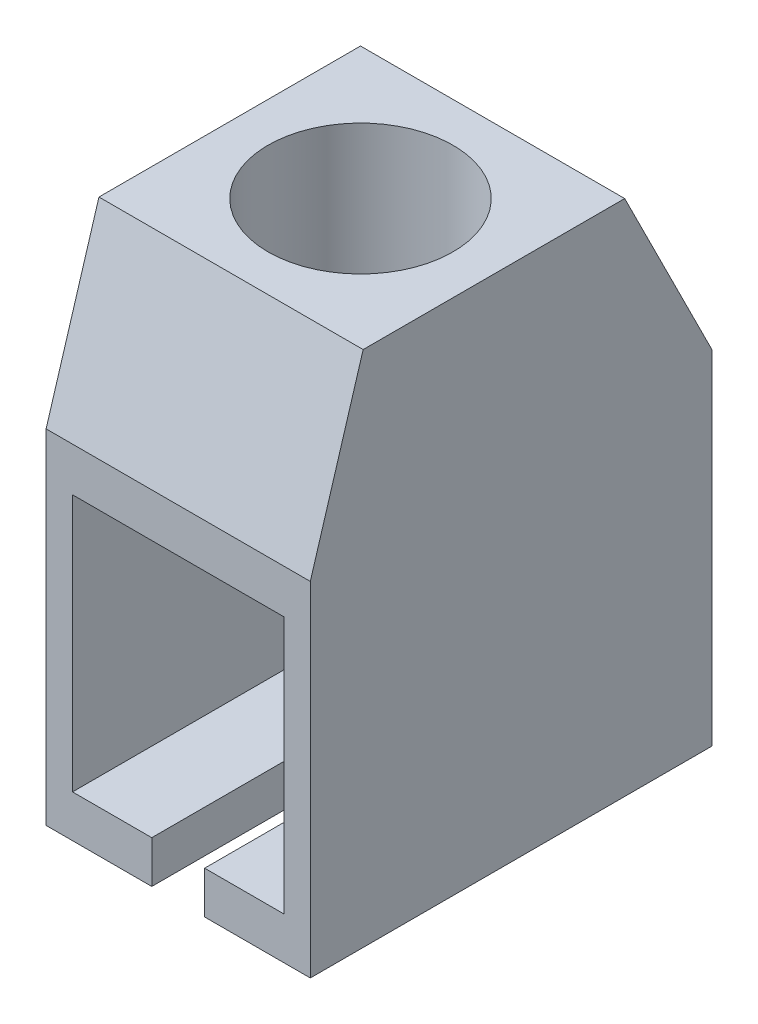
ISO-10303-21;
HEADER;
FILE_DESCRIPTION(('STEP AP214'),'2;1');
FILE_NAME('part.step','',(''),(''),'','','');
FILE_SCHEMA(('AUTOMOTIVE_DESIGN { 1 0 10303 214 1 1 1 1 }'));
ENDSEC;
DATA;
#1=APPLICATION_CONTEXT('core data for automotive mechanical design processes');
#2=APPLICATION_PROTOCOL_DEFINITION('international standard','automotive_design',2000,#1);
#3=PRODUCT_CONTEXT('',#1,'mechanical');
#4=PRODUCT('Part','Part','',(#3));
#5=PRODUCT_RELATED_PRODUCT_CATEGORY('part','',(#4));
#6=PRODUCT_DEFINITION_FORMATION('','',#4);
#7=PRODUCT_DEFINITION_CONTEXT('part definition',#1,'design');
#8=PRODUCT_DEFINITION('design','',#6,#7);
#9=PRODUCT_DEFINITION_SHAPE('','',#8);
#10=(LENGTH_UNIT() NAMED_UNIT(*) SI_UNIT(.MILLI.,.METRE.));
#11=(NAMED_UNIT(*) PLANE_ANGLE_UNIT() SI_UNIT($,.RADIAN.));
#12=(NAMED_UNIT(*) SI_UNIT($,.STERADIAN.) SOLID_ANGLE_UNIT());
#13=UNCERTAINTY_MEASURE_WITH_UNIT(LENGTH_MEASURE(1.E-05),#10,'distance_accuracy_value','');
#14=(GEOMETRIC_REPRESENTATION_CONTEXT(3) GLOBAL_UNCERTAINTY_ASSIGNED_CONTEXT((#13)) GLOBAL_UNIT_ASSIGNED_CONTEXT((#10,
#11,#12)) REPRESENTATION_CONTEXT('',''));
#15=CARTESIAN_POINT('',(0.,0.,0.));
#16=DIRECTION('',(0.,0.,1.));
#17=DIRECTION('',(1.,0.,0.));
#18=AXIS2_PLACEMENT_3D('',#15,#16,#17);
#19=CARTESIAN_POINT('',(-2.5,6.5,-3.8));
#20=DIRECTION('',(1.,0.,0.));
#21=DIRECTION('',(0.,0.,-1.));
#22=AXIS2_PLACEMENT_3D('',#19,#20,#21);
#23=PLANE('',#22);
#24=DIRECTION('',(0.,0.,1.));
#25=VECTOR('',#24,1.);
#26=CARTESIAN_POINT('',(-2.5,9.8,-3.8));
#27=LINE('',#26,#25);
#28=CARTESIAN_POINT('',(-2.5,9.8,-2.15));
#29=VERTEX_POINT('',#28);
#30=CARTESIAN_POINT('',(-2.5,9.8,2.8));
#31=VERTEX_POINT('',#30);
#32=EDGE_CURVE('E249',#29,#31,#27,.T.);
#33=ORIENTED_EDGE('',*,*,#32,.F.);
#34=DIRECTION('',(0.,-0.894427190999917,-0.447213595499956));
#35=VECTOR('',#34,1.);
#36=CARTESIAN_POINT('',(-2.5,9.8,-2.15));
#37=LINE('',#36,#35);
#38=CARTESIAN_POINT('',(-2.5,6.49999999999998,-3.8));
#39=VERTEX_POINT('',#38);
#40=EDGE_CURVE('E245',#29,#39,#37,.T.);
#41=ORIENTED_EDGE('',*,*,#40,.T.);
#42=DIRECTION('',(0.,-1.,0.));
#43=VECTOR('',#42,1.);
#44=CARTESIAN_POINT('',(-2.5,6.5,-3.8));
#45=LINE('',#44,#43);
#46=CARTESIAN_POINT('',(-2.5,0.,-3.8));
#47=VERTEX_POINT('',#46);
#48=EDGE_CURVE('E221',#39,#47,#45,.T.);
#49=ORIENTED_EDGE('',*,*,#48,.T.);
#50=DIRECTION('',(0.,0.,1.));
#51=VECTOR('',#50,1.);
#52=CARTESIAN_POINT('',(-2.5,0.,-3.8));
#53=LINE('',#52,#51);
#54=CARTESIAN_POINT('',(-2.5,0.,3.8));
#55=VERTEX_POINT('',#54);
#56=EDGE_CURVE('E203',#47,#55,#53,.T.);
#57=ORIENTED_EDGE('',*,*,#56,.T.);
#58=DIRECTION('',(0.,-1.,0.));
#59=VECTOR('',#58,1.);
#60=CARTESIAN_POINT('',(-2.5,6.5,3.8));
#61=LINE('',#60,#59);
#62=CARTESIAN_POINT('',(-2.5,6.49999999999995,3.8));
#63=VERTEX_POINT('',#62);
#64=EDGE_CURVE('E227',#63,#55,#61,.T.);
#65=ORIENTED_EDGE('',*,*,#64,.F.);
#66=DIRECTION('',(0.,0.957024404433475,-0.290007395282868));
#67=VECTOR('',#66,1.);
#68=CARTESIAN_POINT('',(-2.5,9.8,2.8));
#69=LINE('',#68,#67);
#70=EDGE_CURVE('E239',#63,#31,#69,.T.);
#71=ORIENTED_EDGE('',*,*,#70,.T.);
#72=EDGE_LOOP('',(#33,#41,#49,#57,#65,#71));
#73=FACE_BOUND('',#72,.T.);
#74=ADVANCED_FACE('F34',(#73),#23,.F.);
#75=CARTESIAN_POINT('',(-2.5,6.5,3.8));
#76=DIRECTION('',(0.,0.,-1.));
#77=DIRECTION('',(-1.,0.,0.));
#78=AXIS2_PLACEMENT_3D('',#75,#76,#77);
#79=PLANE('',#78);
#80=DIRECTION('',(0.,-1.,0.));
#81=VECTOR('',#80,1.);
#82=CARTESIAN_POINT('',(2.5,6.5,3.8));
#83=LINE('',#82,#81);
#84=CARTESIAN_POINT('',(2.5,6.49999999999996,3.8));
#85=VERTEX_POINT('',#84);
#86=CARTESIAN_POINT('',(2.5,0.,3.8));
#87=VERTEX_POINT('',#86);
#88=EDGE_CURVE('E225',#85,#87,#83,.T.);
#89=ORIENTED_EDGE('',*,*,#88,.F.);
#90=DIRECTION('',(-1.,0.,0.));
#91=VECTOR('',#90,1.);
#92=CARTESIAN_POINT('',(-2.5,6.49999999999996,3.8));
#93=LINE('',#92,#91);
#94=EDGE_CURVE('E237',#85,#63,#93,.T.);
#95=ORIENTED_EDGE('',*,*,#94,.T.);
#96=ORIENTED_EDGE('',*,*,#64,.T.);
#97=DIRECTION('',(1.,0.,0.));
#98=VECTOR('',#97,1.);
#99=CARTESIAN_POINT('',(-2.5,0.,3.8));
#100=LINE('',#99,#98);
#101=CARTESIAN_POINT('',(-0.499999999999999,0.,3.8));
#102=VERTEX_POINT('',#101);
#103=EDGE_CURVE('E212',#55,#102,#100,.T.);
#104=ORIENTED_EDGE('',*,*,#103,.T.);
#105=DIRECTION('',(0.,-1.,0.));
#106=VECTOR('',#105,1.);
#107=CARTESIAN_POINT('',(-0.499999999999999,2.,3.8));
#108=LINE('',#107,#106);
#109=CARTESIAN_POINT('',(-0.499999999999999,0.8,3.8));
#110=VERTEX_POINT('',#109);
#111=EDGE_CURVE('E206',#110,#102,#108,.T.);
#112=ORIENTED_EDGE('',*,*,#111,.F.);
#113=DIRECTION('',(1.,0.,0.));
#114=VECTOR('',#113,1.);
#115=CARTESIAN_POINT('',(-2.,0.8,3.8));
#116=LINE('',#115,#114);
#117=CARTESIAN_POINT('',(-2.,0.8,3.8));
#118=VERTEX_POINT('',#117);
#119=EDGE_CURVE('E176',#118,#110,#116,.T.);
#120=ORIENTED_EDGE('',*,*,#119,.F.);
#121=DIRECTION('',(0.,-1.,0.));
#122=VECTOR('',#121,1.);
#123=CARTESIAN_POINT('',(-2.,5.67,3.8));
#124=LINE('',#123,#122);
#125=CARTESIAN_POINT('',(-2.,5.67,3.8));
#126=VERTEX_POINT('',#125);
#127=EDGE_CURVE('E143',#126,#118,#124,.T.);
#128=ORIENTED_EDGE('',*,*,#127,.F.);
#129=DIRECTION('',(-1.,0.,0.));
#130=VECTOR('',#129,1.);
#131=CARTESIAN_POINT('',(-2.,5.67,3.8));
#132=LINE('',#131,#130);
#133=CARTESIAN_POINT('',(2.,5.67,3.8));
#134=VERTEX_POINT('',#133);
#135=EDGE_CURVE('E163',#134,#126,#132,.T.);
#136=ORIENTED_EDGE('',*,*,#135,.F.);
#137=DIRECTION('',(0.,1.,0.));
#138=VECTOR('',#137,1.);
#139=CARTESIAN_POINT('',(2.,5.67,3.8));
#140=LINE('',#139,#138);
#141=CARTESIAN_POINT('',(2.,0.8,3.8));
#142=VERTEX_POINT('',#141);
#143=EDGE_CURVE('E166',#142,#134,#140,.T.);
#144=ORIENTED_EDGE('',*,*,#143,.F.);
#145=CARTESIAN_POINT('',(0.500000000000001,0.8,3.8));
#146=VERTEX_POINT('',#145);
#147=EDGE_CURVE('E175',#146,#142,#116,.T.);
#148=ORIENTED_EDGE('',*,*,#147,.F.);
#149=DIRECTION('',(0.,-1.,0.));
#150=VECTOR('',#149,1.);
#151=CARTESIAN_POINT('',(0.500000000000001,2.,3.8));
#152=LINE('',#151,#150);
#153=CARTESIAN_POINT('',(0.500000000000001,0.,3.8));
#154=VERTEX_POINT('',#153);
#155=EDGE_CURVE('E200',#146,#154,#152,.T.);
#156=ORIENTED_EDGE('',*,*,#155,.T.);
#157=EDGE_CURVE('E211',#154,#87,#100,.T.);
#158=ORIENTED_EDGE('',*,*,#157,.T.);
#159=EDGE_LOOP('',(#89,#95,#96,#104,#112,#120,#128,#136,#144,#148,#156,#158));
#160=FACE_BOUND('',#159,.T.);
#161=ADVANCED_FACE('F287',(#160),#79,.F.);
#162=CARTESIAN_POINT('',(2.5,6.5,-3.8));
#163=DIRECTION('',(-1.,0.,0.));
#164=DIRECTION('',(0.,0.,1.));
#165=AXIS2_PLACEMENT_3D('',#162,#163,#164);
#166=PLANE('',#165);
#167=DIRECTION('',(0.,-1.,0.));
#168=VECTOR('',#167,1.);
#169=CARTESIAN_POINT('',(2.5,6.5,-3.8));
#170=LINE('',#169,#168);
#171=CARTESIAN_POINT('',(2.5,6.49999999999997,-3.8));
#172=VERTEX_POINT('',#171);
#173=CARTESIAN_POINT('',(2.5,0.,-3.8));
#174=VERTEX_POINT('',#173);
#175=EDGE_CURVE('E223',#172,#174,#170,.T.);
#176=ORIENTED_EDGE('',*,*,#175,.F.);
#177=DIRECTION('',(0.,0.894427190999917,0.447213595499956));
#178=VECTOR('',#177,1.);
#179=CARTESIAN_POINT('',(2.5,9.8,-2.15));
#180=LINE('',#179,#178);
#181=CARTESIAN_POINT('',(2.5,9.8,-2.15));
#182=VERTEX_POINT('',#181);
#183=EDGE_CURVE('E11',#172,#182,#180,.T.);
#184=ORIENTED_EDGE('',*,*,#183,.T.);
#185=DIRECTION('',(0.,0.,-1.));
#186=VECTOR('',#185,1.);
#187=CARTESIAN_POINT('',(2.5,9.8,-3.8));
#188=LINE('',#187,#186);
#189=CARTESIAN_POINT('',(2.5,9.8,2.8));
#190=VERTEX_POINT('',#189);
#191=EDGE_CURVE('E169',#190,#182,#188,.T.);
#192=ORIENTED_EDGE('',*,*,#191,.F.);
#193=DIRECTION('',(0.,-0.957024404433475,0.290007395282868));
#194=VECTOR('',#193,1.);
#195=CARTESIAN_POINT('',(2.5,9.8,2.8));
#196=LINE('',#195,#194);
#197=EDGE_CURVE('E235',#190,#85,#196,.T.);
#198=ORIENTED_EDGE('',*,*,#197,.T.);
#199=ORIENTED_EDGE('',*,*,#88,.T.);
#200=DIRECTION('',(0.,0.,-1.));
#201=VECTOR('',#200,1.);
#202=CARTESIAN_POINT('',(2.5,0.,-3.8));
#203=LINE('',#202,#201);
#204=EDGE_CURVE('E215',#87,#174,#203,.T.);
#205=ORIENTED_EDGE('',*,*,#204,.T.);
#206=EDGE_LOOP('',(#176,#184,#192,#198,#199,#205));
#207=FACE_BOUND('',#206,.T.);
#208=ADVANCED_FACE('F259',(#207),#166,.F.);
#209=CARTESIAN_POINT('',(-2.5,6.5,-3.8));
#210=DIRECTION('',(0.,0.,1.));
#211=DIRECTION('',(1.,0.,0.));
#212=AXIS2_PLACEMENT_3D('',#209,#210,#211);
#213=PLANE('',#212);
#214=ORIENTED_EDGE('',*,*,#48,.F.);
#215=DIRECTION('',(1.,0.,0.));
#216=VECTOR('',#215,1.);
#217=CARTESIAN_POINT('',(2.5,6.49999999999998,-3.8));
#218=LINE('',#217,#216);
#219=EDGE_CURVE('E43',#39,#172,#218,.T.);
#220=ORIENTED_EDGE('',*,*,#219,.T.);
#221=ORIENTED_EDGE('',*,*,#175,.T.);
#222=DIRECTION('',(-1.,0.,0.));
#223=VECTOR('',#222,1.);
#224=CARTESIAN_POINT('',(-2.5,0.,-3.8));
#225=LINE('',#224,#223);
#226=EDGE_CURVE('E218',#174,#47,#225,.T.);
#227=ORIENTED_EDGE('',*,*,#226,.T.);
#228=EDGE_LOOP('',(#214,#220,#221,#227));
#229=FACE_BOUND('',#228,.T.);
#230=ADVANCED_FACE('F252',(#229),#213,.F.);
#231=CARTESIAN_POINT('',(0.,0.,0.));
#232=DIRECTION('',(0.,1.,0.));
#233=DIRECTION('',(0.,0.,1.));
#234=AXIS2_PLACEMENT_3D('',#231,#232,#233);
#235=PLANE('',#234);
#236=ORIENTED_EDGE('',*,*,#157,.F.);
#237=DIRECTION('',(0.,0.,1.));
#238=VECTOR('',#237,1.);
#239=CARTESIAN_POINT('',(0.500000000000001,0.,3.8));
#240=LINE('',#239,#238);
#241=CARTESIAN_POINT('',(0.500000000000002,0.,0.0499999999999999));
#242=VERTEX_POINT('',#241);
#243=EDGE_CURVE('E191',#242,#154,#240,.T.);
#244=ORIENTED_EDGE('',*,*,#243,.F.);
#245=DIRECTION('',(1.,0.,0.));
#246=VECTOR('',#245,1.);
#247=CARTESIAN_POINT('',(0.500000000000002,0.,0.0499999999999999));
#248=LINE('',#247,#246);
#249=CARTESIAN_POINT('',(-0.499999999999998,0.,0.0499999999999998));
#250=VERTEX_POINT('',#249);
#251=EDGE_CURVE('E197',#250,#242,#248,.T.);
#252=ORIENTED_EDGE('',*,*,#251,.F.);
#253=DIRECTION('',(0.,0.,-1.));
#254=VECTOR('',#253,1.);
#255=CARTESIAN_POINT('',(-0.499999999999999,0.,3.8));
#256=LINE('',#255,#254);
#257=EDGE_CURVE('E194',#102,#250,#256,.T.);
#258=ORIENTED_EDGE('',*,*,#257,.F.);
#259=ORIENTED_EDGE('',*,*,#103,.F.);
#260=ORIENTED_EDGE('',*,*,#56,.F.);
#261=ORIENTED_EDGE('',*,*,#226,.F.);
#262=ORIENTED_EDGE('',*,*,#204,.F.);
#263=EDGE_LOOP('',(#236,#244,#252,#258,#259,#260,#261,#262));
#264=FACE_BOUND('',#263,.T.);
#265=ADVANCED_FACE('F299',(#264),#235,.F.);
#266=CARTESIAN_POINT('',(0.500000000000001,2.,3.8));
#267=DIRECTION('',(1.,0.,0.));
#268=DIRECTION('',(0.,0.,-1.));
#269=AXIS2_PLACEMENT_3D('',#266,#267,#268);
#270=PLANE('',#269);
#271=ORIENTED_EDGE('',*,*,#155,.F.);
#272=DIRECTION('',(0.,0.,-1.));
#273=VECTOR('',#272,1.);
#274=CARTESIAN_POINT('',(0.500000000000001,0.8,3.8));
#275=LINE('',#274,#273);
#276=CARTESIAN_POINT('',(0.500000000000002,0.8,0.0499999999999999));
#277=VERTEX_POINT('',#276);
#278=EDGE_CURVE('E188',#146,#277,#275,.T.);
#279=ORIENTED_EDGE('',*,*,#278,.T.);
#280=DIRECTION('',(0.,-1.,0.));
#281=VECTOR('',#280,1.);
#282=CARTESIAN_POINT('',(0.500000000000002,2.,0.0499999999999999));
#283=LINE('',#282,#281);
#284=EDGE_CURVE('E201',#277,#242,#283,.T.);
#285=ORIENTED_EDGE('',*,*,#284,.T.);
#286=ORIENTED_EDGE('',*,*,#243,.T.);
#287=EDGE_LOOP('',(#271,#279,#285,#286));
#288=FACE_BOUND('',#287,.T.);
#289=ADVANCED_FACE('F302',(#288),#270,.F.);
#290=CARTESIAN_POINT('',(0.500000000000002,2.,0.0499999999999999));
#291=DIRECTION('',(0.,0.,-1.));
#292=DIRECTION('',(-1.,0.,0.));
#293=AXIS2_PLACEMENT_3D('',#290,#291,#292);
#294=PLANE('',#293);
#295=ORIENTED_EDGE('',*,*,#284,.F.);
#296=DIRECTION('',(-1.,0.,0.));
#297=VECTOR('',#296,1.);
#298=CARTESIAN_POINT('',(0.500000000000002,0.8,0.0499999999999999));
#299=LINE('',#298,#297);
#300=CARTESIAN_POINT('',(-0.499999999999998,0.8,0.0500000000000001));
#301=VERTEX_POINT('',#300);
#302=EDGE_CURVE('E182',#277,#301,#299,.T.);
#303=ORIENTED_EDGE('',*,*,#302,.T.);
#304=DIRECTION('',(0.,-1.,0.));
#305=VECTOR('',#304,1.);
#306=CARTESIAN_POINT('',(-0.499999999999998,2.,0.0499999999999998));
#307=LINE('',#306,#305);
#308=EDGE_CURVE('E204',#301,#250,#307,.T.);
#309=ORIENTED_EDGE('',*,*,#308,.T.);
#310=ORIENTED_EDGE('',*,*,#251,.T.);
#311=EDGE_LOOP('',(#295,#303,#309,#310));
#312=FACE_BOUND('',#311,.T.);
#313=ADVANCED_FACE('F306',(#312),#294,.F.);
#314=CARTESIAN_POINT('',(-0.499999999999999,2.,3.8));
#315=DIRECTION('',(-1.,0.,0.));
#316=DIRECTION('',(0.,0.,1.));
#317=AXIS2_PLACEMENT_3D('',#314,#315,#316);
#318=PLANE('',#317);
#319=ORIENTED_EDGE('',*,*,#308,.F.);
#320=DIRECTION('',(0.,0.,1.));
#321=VECTOR('',#320,1.);
#322=CARTESIAN_POINT('',(-0.499999999999999,0.8,3.8));
#323=LINE('',#322,#321);
#324=EDGE_CURVE('E229',#301,#110,#323,.T.);
#325=ORIENTED_EDGE('',*,*,#324,.T.);
#326=ORIENTED_EDGE('',*,*,#111,.T.);
#327=ORIENTED_EDGE('',*,*,#257,.T.);
#328=EDGE_LOOP('',(#319,#325,#326,#327));
#329=FACE_BOUND('',#328,.T.);
#330=ADVANCED_FACE('F308',(#329),#318,.F.);
#331=CARTESIAN_POINT('',(-2.,0.8,-3.));
#332=DIRECTION('',(0.,-1.,0.));
#333=DIRECTION('',(0.,0.,-1.));
#334=AXIS2_PLACEMENT_3D('',#331,#332,#333);
#335=PLANE('',#334);
#336=ORIENTED_EDGE('',*,*,#147,.T.);
#337=DIRECTION('',(0.,0.,1.));
#338=VECTOR('',#337,1.);
#339=CARTESIAN_POINT('',(2.,0.8,-3.));
#340=LINE('',#339,#338);
#341=CARTESIAN_POINT('',(2.,0.8,-3.));
#342=VERTEX_POINT('',#341);
#343=EDGE_CURVE('E146',#342,#142,#340,.T.);
#344=ORIENTED_EDGE('',*,*,#343,.F.);
#345=DIRECTION('',(1.,0.,0.));
#346=VECTOR('',#345,1.);
#347=CARTESIAN_POINT('',(-2.,0.8,-3.));
#348=LINE('',#347,#346);
#349=CARTESIAN_POINT('',(-2.,0.8,-3.));
#350=VERTEX_POINT('',#349);
#351=EDGE_CURVE('E150',#350,#342,#348,.T.);
#352=ORIENTED_EDGE('',*,*,#351,.F.);
#353=DIRECTION('',(0.,0.,1.));
#354=VECTOR('',#353,1.);
#355=CARTESIAN_POINT('',(-2.,0.8,-3.));
#356=LINE('',#355,#354);
#357=EDGE_CURVE('E137',#350,#118,#356,.T.);
#358=ORIENTED_EDGE('',*,*,#357,.T.);
#359=ORIENTED_EDGE('',*,*,#119,.T.);
#360=ORIENTED_EDGE('',*,*,#324,.F.);
#361=ORIENTED_EDGE('',*,*,#302,.F.);
#362=ORIENTED_EDGE('',*,*,#278,.F.);
#363=EDGE_LOOP('',(#336,#344,#352,#358,#359,#360,#361,#362));
#364=FACE_BOUND('',#363,.T.);
#365=ADVANCED_FACE('F151',(#364),#335,.F.);
#366=CARTESIAN_POINT('',(-2.,5.67,-3.));
#367=DIRECTION('',(-1.,0.,0.));
#368=DIRECTION('',(0.,-1.,0.));
#369=AXIS2_PLACEMENT_3D('',#366,#367,#368);
#370=PLANE('',#369);
#371=ORIENTED_EDGE('',*,*,#127,.T.);
#372=ORIENTED_EDGE('',*,*,#357,.F.);
#373=DIRECTION('',(0.,-1.,0.));
#374=VECTOR('',#373,1.);
#375=CARTESIAN_POINT('',(-2.,5.67,-3.));
#376=LINE('',#375,#374);
#377=CARTESIAN_POINT('',(-2.,5.67,-3.));
#378=VERTEX_POINT('',#377);
#379=EDGE_CURVE('E141',#378,#350,#376,.T.);
#380=ORIENTED_EDGE('',*,*,#379,.F.);
#381=DIRECTION('',(0.,0.,1.));
#382=VECTOR('',#381,1.);
#383=CARTESIAN_POINT('',(-2.,5.67,-3.));
#384=LINE('',#383,#382);
#385=EDGE_CURVE('E180',#378,#126,#384,.T.);
#386=ORIENTED_EDGE('',*,*,#385,.T.);
#387=EDGE_LOOP('',(#371,#372,#380,#386));
#388=FACE_BOUND('',#387,.T.);
#389=ADVANCED_FACE('F139',(#388),#370,.F.);
#390=CARTESIAN_POINT('',(-2.,5.67,-3.));
#391=DIRECTION('',(0.,1.,0.));
#392=DIRECTION('',(0.,0.,1.));
#393=AXIS2_PLACEMENT_3D('',#390,#391,#392);
#394=PLANE('',#393);
#395=CARTESIAN_POINT('',(0.,5.67,0.350000000000002));
#396=DIRECTION('',(0.,1.,0.));
#397=DIRECTION('',(0.,0.,1.));
#398=AXIS2_PLACEMENT_3D('',#395,#396,#397);
#399=CIRCLE('',#398,1.75);
#400=CARTESIAN_POINT('',(0.,5.67,2.1));
#401=VERTEX_POINT('',#400);
#402=EDGE_CURVE('E266',#401,#401,#399,.F.);
#403=ORIENTED_EDGE('',*,*,#402,.F.);
#404=EDGE_LOOP('',(#403));
#405=FACE_BOUND('',#404,.T.);
#406=DIRECTION('',(-1.,0.,0.));
#407=VECTOR('',#406,1.);
#408=CARTESIAN_POINT('',(-2.,5.67,-3.));
#409=LINE('',#408,#407);
#410=CARTESIAN_POINT('',(0.,5.67,-3.));
#411=VERTEX_POINT('',#410);
#412=EDGE_CURVE('E161',#411,#378,#409,.T.);
#413=ORIENTED_EDGE('',*,*,#412,.F.);
#414=CARTESIAN_POINT('',(0.,5.67,-2.6));
#415=DIRECTION('',(0.,-1.,0.));
#416=DIRECTION('',(0.,0.,-1.));
#417=AXIS2_PLACEMENT_3D('',#414,#415,#416);
#418=CIRCLE('',#417,0.4);
#419=EDGE_CURVE('E48',#411,#411,#418,.T.);
#420=ORIENTED_EDGE('',*,*,#419,.F.);
#421=CARTESIAN_POINT('',(2.,5.67,-3.));
#422=VERTEX_POINT('',#421);
#423=EDGE_CURVE('E147',#422,#411,#409,.T.);
#424=ORIENTED_EDGE('',*,*,#423,.F.);
#425=DIRECTION('',(0.,0.,1.));
#426=VECTOR('',#425,1.);
#427=CARTESIAN_POINT('',(2.,5.67,-3.));
#428=LINE('',#427,#426);
#429=EDGE_CURVE('E183',#422,#134,#428,.T.);
#430=ORIENTED_EDGE('',*,*,#429,.T.);
#431=ORIENTED_EDGE('',*,*,#135,.T.);
#432=ORIENTED_EDGE('',*,*,#385,.F.);
#433=EDGE_LOOP('',(#413,#420,#424,#430,#431,#432));
#434=FACE_BOUND('',#433,.T.);
#435=ADVANCED_FACE('F317',(#405,#434),#394,.F.);
#436=CARTESIAN_POINT('',(2.,5.67,-3.));
#437=DIRECTION('',(1.,0.,0.));
#438=DIRECTION('',(0.,1.,0.));
#439=AXIS2_PLACEMENT_3D('',#436,#437,#438);
#440=PLANE('',#439);
#441=ORIENTED_EDGE('',*,*,#143,.T.);
#442=ORIENTED_EDGE('',*,*,#429,.F.);
#443=DIRECTION('',(0.,1.,0.));
#444=VECTOR('',#443,1.);
#445=CARTESIAN_POINT('',(2.,5.67,-3.));
#446=LINE('',#445,#444);
#447=EDGE_CURVE('E156',#342,#422,#446,.T.);
#448=ORIENTED_EDGE('',*,*,#447,.F.);
#449=ORIENTED_EDGE('',*,*,#343,.T.);
#450=EDGE_LOOP('',(#441,#442,#448,#449));
#451=FACE_BOUND('',#450,.T.);
#452=ADVANCED_FACE('F283',(#451),#440,.F.);
#453=CARTESIAN_POINT('',(0.,0.,-3.));
#454=DIRECTION('',(0.,0.,1.));
#455=DIRECTION('',(1.,0.,0.));
#456=AXIS2_PLACEMENT_3D('',#453,#454,#455);
#457=PLANE('',#456);
#458=ORIENTED_EDGE('',*,*,#379,.T.);
#459=ORIENTED_EDGE('',*,*,#351,.T.);
#460=ORIENTED_EDGE('',*,*,#447,.T.);
#461=ORIENTED_EDGE('',*,*,#423,.T.);
#462=ORIENTED_EDGE('',*,*,#412,.T.);
#463=EDGE_LOOP('',(#458,#459,#460,#461,#462));
#464=FACE_BOUND('',#463,.T.);
#465=ADVANCED_FACE('F158',(#464),#457,.T.);
#466=CARTESIAN_POINT('',(0.,9.8,0.));
#467=DIRECTION('',(0.,1.,0.));
#468=DIRECTION('',(0.,0.,1.));
#469=AXIS2_PLACEMENT_3D('',#466,#467,#468);
#470=PLANE('',#469);
#471=CARTESIAN_POINT('',(0.,9.8,0.350000000000002));
#472=DIRECTION('',(0.,1.,0.));
#473=DIRECTION('',(0.,0.,1.));
#474=AXIS2_PLACEMENT_3D('',#471,#472,#473);
#475=CIRCLE('',#474,1.75);
#476=CARTESIAN_POINT('',(0.,9.8,2.1));
#477=VERTEX_POINT('',#476);
#478=EDGE_CURVE('E269',#477,#477,#475,.T.);
#479=ORIENTED_EDGE('',*,*,#478,.F.);
#480=EDGE_LOOP('',(#479));
#481=FACE_BOUND('',#480,.T.);
#482=ORIENTED_EDGE('',*,*,#191,.T.);
#483=DIRECTION('',(-1.,0.,0.));
#484=VECTOR('',#483,1.);
#485=CARTESIAN_POINT('',(-2.5,9.8,-2.15));
#486=LINE('',#485,#484);
#487=EDGE_CURVE('E242',#182,#29,#486,.T.);
#488=ORIENTED_EDGE('',*,*,#487,.T.);
#489=ORIENTED_EDGE('',*,*,#32,.T.);
#490=DIRECTION('',(1.,0.,0.));
#491=VECTOR('',#490,1.);
#492=CARTESIAN_POINT('',(2.5,9.8,2.8));
#493=LINE('',#492,#491);
#494=EDGE_CURVE('E232',#31,#190,#493,.T.);
#495=ORIENTED_EDGE('',*,*,#494,.T.);
#496=EDGE_LOOP('',(#482,#488,#489,#495));
#497=FACE_BOUND('',#496,.T.);
#498=ADVANCED_FACE('F261',(#481,#497),#470,.T.);
#499=CARTESIAN_POINT('',(0.,9.8,2.8));
#500=DIRECTION('',(0.,0.290007395282868,0.957024404433474));
#501=DIRECTION('',(-1.,0.,0.));
#502=AXIS2_PLACEMENT_3D('',#499,#500,#501);
#503=PLANE('',#502);
#504=ORIENTED_EDGE('',*,*,#70,.F.);
#505=ORIENTED_EDGE('',*,*,#94,.F.);
#506=ORIENTED_EDGE('',*,*,#197,.F.);
#507=ORIENTED_EDGE('',*,*,#494,.F.);
#508=EDGE_LOOP('',(#504,#505,#506,#507));
#509=FACE_BOUND('',#508,.T.);
#510=ADVANCED_FACE('F276',(#509),#503,.T.);
#511=CARTESIAN_POINT('',(0.,9.8,-2.15));
#512=DIRECTION('',(0.,0.447213595499956,-0.894427190999917));
#513=DIRECTION('',(1.,0.,0.));
#514=AXIS2_PLACEMENT_3D('',#511,#512,#513);
#515=PLANE('',#514);
#516=CARTESIAN_POINT('',(0.,8.89999999999999,-2.6));
#517=DIRECTION('',(0.,0.447213595499956,-0.894427190999917));
#518=DIRECTION('',(0.,-0.894427190999917,-0.447213595499956));
#519=AXIS2_PLACEMENT_3D('',#516,#517,#518);
#520=ELLIPSE('',#519,0.89442719099992,0.4);
#521=CARTESIAN_POINT('',(0.,8.09999999999999,-3.));
#522=VERTEX_POINT('',#521);
#523=EDGE_CURVE('E38',#522,#522,#520,.T.);
#524=ORIENTED_EDGE('',*,*,#523,.F.);
#525=EDGE_LOOP('',(#524));
#526=FACE_BOUND('',#525,.T.);
#527=ORIENTED_EDGE('',*,*,#183,.F.);
#528=ORIENTED_EDGE('',*,*,#219,.F.);
#529=ORIENTED_EDGE('',*,*,#40,.F.);
#530=ORIENTED_EDGE('',*,*,#487,.F.);
#531=EDGE_LOOP('',(#527,#528,#529,#530));
#532=FACE_BOUND('',#531,.T.);
#533=ADVANCED_FACE('F36',(#526,#532),#515,.T.);
#534=CARTESIAN_POINT('',(0.,10.67,-2.6));
#535=DIRECTION('',(0.,-1.,0.));
#536=DIRECTION('',(0.,0.,-1.));
#537=AXIS2_PLACEMENT_3D('',#534,#535,#536);
#538=CYLINDRICAL_SURFACE('',#537,0.4);
#539=ORIENTED_EDGE('',*,*,#523,.T.);
#540=EDGE_LOOP('',(#539));
#541=FACE_BOUND('',#540,.T.);
#542=ORIENTED_EDGE('',*,*,#419,.T.);
#543=EDGE_LOOP('',(#542));
#544=FACE_BOUND('',#543,.T.);
#545=ADVANCED_FACE('F350',(#541,#544),#538,.F.);
#546=CARTESIAN_POINT('',(0.,0.720252531694167,0.350000000000002));
#547=DIRECTION('',(0.,1.,0.));
#548=DIRECTION('',(0.,0.,1.));
#549=AXIS2_PLACEMENT_3D('',#546,#547,#548);
#550=CYLINDRICAL_SURFACE('',#549,1.75);
#551=ORIENTED_EDGE('',*,*,#402,.T.);
#552=EDGE_LOOP('',(#551));
#553=FACE_BOUND('',#552,.T.);
#554=ORIENTED_EDGE('',*,*,#478,.T.);
#555=EDGE_LOOP('',(#554));
#556=FACE_BOUND('',#555,.T.);
#557=ADVANCED_FACE('F273',(#553,#556),#550,.F.);
#558=CLOSED_SHELL('',(#74,#161,#208,#230,#265,#289,#313,#330,#365,#389,#435,#452,#465,#498,#510,
#533,#545,#557));
#559=MANIFOLD_SOLID_BREP('B2',#558);
#560=ADVANCED_BREP_SHAPE_REPRESENTATION('',(#18,#559),#14);
#561=SHAPE_DEFINITION_REPRESENTATION(#9,#560);
ENDSEC;
END-ISO-10303-21;
